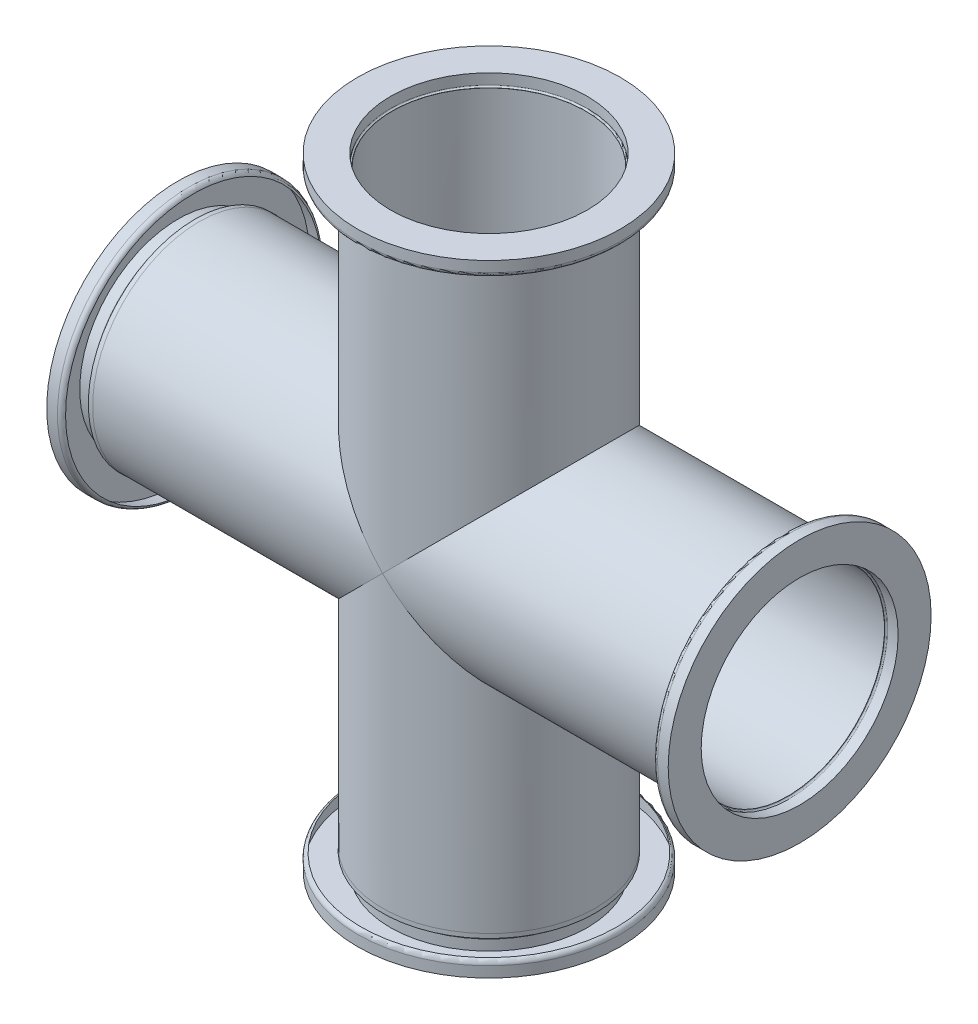
ISO-10303-21;
HEADER;
FILE_DESCRIPTION(('STEP AP214'),'2;1');
FILE_NAME('part.step','',(''),(''),'','','');
FILE_SCHEMA(('AUTOMOTIVE_DESIGN { 1 0 10303 214 1 1 1 1 }'));
ENDSEC;
DATA;
#1=APPLICATION_CONTEXT('core data for automotive mechanical design processes');
#2=APPLICATION_PROTOCOL_DEFINITION('international standard','automotive_design',2000,#1);
#3=PRODUCT_CONTEXT('',#1,'mechanical');
#4=PRODUCT('Part','Part','',(#3));
#5=PRODUCT_RELATED_PRODUCT_CATEGORY('part','',(#4));
#6=PRODUCT_DEFINITION_FORMATION('','',#4);
#7=PRODUCT_DEFINITION_CONTEXT('part definition',#1,'design');
#8=PRODUCT_DEFINITION('design','',#6,#7);
#9=PRODUCT_DEFINITION_SHAPE('','',#8);
#10=(LENGTH_UNIT() NAMED_UNIT(*) SI_UNIT(.MILLI.,.METRE.));
#11=(NAMED_UNIT(*) PLANE_ANGLE_UNIT() SI_UNIT($,.RADIAN.));
#12=(NAMED_UNIT(*) SI_UNIT($,.STERADIAN.) SOLID_ANGLE_UNIT());
#13=UNCERTAINTY_MEASURE_WITH_UNIT(LENGTH_MEASURE(1.E-05),#10,'distance_accuracy_value','');
#14=(GEOMETRIC_REPRESENTATION_CONTEXT(3) GLOBAL_UNCERTAINTY_ASSIGNED_CONTEXT((#13)) GLOBAL_UNIT_ASSIGNED_CONTEXT((#10,
#11,#12)) REPRESENTATION_CONTEXT('',''));
#15=CARTESIAN_POINT('',(0.,0.,0.));
#16=DIRECTION('',(0.,0.,1.));
#17=DIRECTION('',(1.,0.,0.));
#18=AXIS2_PLACEMENT_3D('',#15,#16,#17);
#19=CARTESIAN_POINT('',(0.,61.5,0.));
#20=DIRECTION('',(0.,1.,0.));
#21=DIRECTION('',(0.,0.,-1.));
#22=AXIS2_PLACEMENT_3D('',#19,#20,#21);
#23=PLANE('',#22);
#24=CARTESIAN_POINT('',(0.,61.5,0.));
#25=DIRECTION('',(0.,1.,0.));
#26=DIRECTION('',(0.,0.,1.));
#27=AXIS2_PLACEMENT_3D('',#24,#25,#26);
#28=CIRCLE('',#27,22.25);
#29=CARTESIAN_POINT('',(0.,61.5,22.25));
#30=VERTEX_POINT('',#29);
#31=EDGE_CURVE('E407',#30,#30,#28,.T.);
#32=ORIENTED_EDGE('',*,*,#31,.T.);
#33=EDGE_LOOP('',(#32));
#34=FACE_BOUND('',#33,.T.);
#35=CARTESIAN_POINT('',(0.,61.5,0.));
#36=DIRECTION('',(0.,1.,0.));
#37=DIRECTION('',(-1.,0.,0.));
#38=AXIS2_PLACEMENT_3D('',#35,#36,#37);
#39=CIRCLE('',#38,22.3);
#40=CARTESIAN_POINT('',(22.3,61.5,0.));
#41=VERTEX_POINT('',#40);
#42=EDGE_CURVE('E188',#41,#41,#39,.T.);
#43=ORIENTED_EDGE('',*,*,#42,.F.);
#44=EDGE_LOOP('',(#43));
#45=FACE_BOUND('',#44,.T.);
#46=ADVANCED_FACE('F17',(#34,#45),#23,.F.);
#47=CARTESIAN_POINT('',(0.,-61.5,0.));
#48=DIRECTION('',(0.,-1.,0.));
#49=DIRECTION('',(0.,0.,-1.));
#50=AXIS2_PLACEMENT_3D('',#47,#48,#49);
#51=PLANE('',#50);
#52=CARTESIAN_POINT('',(0.,-61.5,0.));
#53=DIRECTION('',(0.,1.,0.));
#54=DIRECTION('',(0.,0.,-1.));
#55=AXIS2_PLACEMENT_3D('',#52,#53,#54);
#56=CIRCLE('',#55,22.25);
#57=CARTESIAN_POINT('',(0.,-61.5,-22.25));
#58=VERTEX_POINT('',#57);
#59=EDGE_CURVE('E312',#58,#58,#56,.T.);
#60=ORIENTED_EDGE('',*,*,#59,.F.);
#61=EDGE_LOOP('',(#60));
#62=FACE_BOUND('',#61,.T.);
#63=CARTESIAN_POINT('',(0.,-61.5,0.));
#64=DIRECTION('',(0.,-1.,0.));
#65=DIRECTION('',(-1.,0.,0.));
#66=AXIS2_PLACEMENT_3D('',#63,#64,#65);
#67=CIRCLE('',#66,22.3);
#68=CARTESIAN_POINT('',(22.3,-61.5,0.));
#69=VERTEX_POINT('',#68);
#70=EDGE_CURVE('E270',#69,#69,#67,.T.);
#71=ORIENTED_EDGE('',*,*,#70,.F.);
#72=EDGE_LOOP('',(#71));
#73=FACE_BOUND('',#72,.T.);
#74=ADVANCED_FACE('F536',(#62,#73),#51,.F.);
#75=CARTESIAN_POINT('',(61.5,0.,0.));
#76=DIRECTION('',(1.,0.,0.));
#77=DIRECTION('',(0.,0.,-1.));
#78=AXIS2_PLACEMENT_3D('',#75,#76,#77);
#79=PLANE('',#78);
#80=CARTESIAN_POINT('',(61.5,0.,0.));
#81=DIRECTION('',(1.,0.,0.));
#82=DIRECTION('',(0.,0.,1.));
#83=AXIS2_PLACEMENT_3D('',#80,#81,#82);
#84=CIRCLE('',#83,22.25);
#85=CARTESIAN_POINT('',(61.5,0.,22.25));
#86=VERTEX_POINT('',#85);
#87=EDGE_CURVE('E506',#86,#86,#84,.T.);
#88=ORIENTED_EDGE('',*,*,#87,.T.);
#89=EDGE_LOOP('',(#88));
#90=FACE_BOUND('',#89,.T.);
#91=CARTESIAN_POINT('',(61.5,0.,0.));
#92=DIRECTION('',(1.,0.,0.));
#93=DIRECTION('',(0.,0.,-1.));
#94=AXIS2_PLACEMENT_3D('',#91,#92,#93);
#95=CIRCLE('',#94,22.3);
#96=CARTESIAN_POINT('',(61.5,0.,22.3));
#97=VERTEX_POINT('',#96);
#98=EDGE_CURVE('E258',#97,#97,#95,.T.);
#99=ORIENTED_EDGE('',*,*,#98,.F.);
#100=EDGE_LOOP('',(#99));
#101=FACE_BOUND('',#100,.T.);
#102=ADVANCED_FACE('F534',(#90,#101),#79,.F.);
#103=CARTESIAN_POINT('',(0.,-62.5,0.));
#104=DIRECTION('',(0.,-1.,0.));
#105=DIRECTION('',(0.,0.,-1.));
#106=AXIS2_PLACEMENT_3D('',#103,#104,#105);
#107=PLANE('',#106);
#108=CARTESIAN_POINT('',(0.,-62.5,0.));
#109=DIRECTION('',(0.,-1.,0.));
#110=DIRECTION('',(-1.,0.,0.));
#111=AXIS2_PLACEMENT_3D('',#108,#109,#110);
#112=CIRCLE('',#111,20.25);
#113=CARTESIAN_POINT('',(20.25,-62.5,0.));
#114=VERTEX_POINT('',#113);
#115=EDGE_CURVE('E416',#114,#114,#112,.T.);
#116=ORIENTED_EDGE('',*,*,#115,.F.);
#117=EDGE_LOOP('',(#116));
#118=FACE_BOUND('',#117,.T.);
#119=CARTESIAN_POINT('',(0.,-62.5,0.));
#120=DIRECTION('',(0.,-1.,0.));
#121=DIRECTION('',(-1.,0.,0.));
#122=AXIS2_PLACEMENT_3D('',#119,#120,#121);
#123=CIRCLE('',#122,20.3);
#124=CARTESIAN_POINT('',(20.3,-62.5,0.));
#125=VERTEX_POINT('',#124);
#126=EDGE_CURVE('E232',#125,#125,#123,.T.);
#127=ORIENTED_EDGE('',*,*,#126,.T.);
#128=EDGE_LOOP('',(#127));
#129=FACE_BOUND('',#128,.T.);
#130=ADVANCED_FACE('F238',(#118,#129),#107,.T.);
#131=CARTESIAN_POINT('',(0.,62.5,0.));
#132=DIRECTION('',(0.,1.,0.));
#133=DIRECTION('',(0.,0.,-1.));
#134=AXIS2_PLACEMENT_3D('',#131,#132,#133);
#135=PLANE('',#134);
#136=CARTESIAN_POINT('',(0.,62.5,0.));
#137=DIRECTION('',(0.,1.,0.));
#138=DIRECTION('',(-1.,0.,0.));
#139=AXIS2_PLACEMENT_3D('',#136,#137,#138);
#140=CIRCLE('',#139,20.25);
#141=CARTESIAN_POINT('',(20.25,62.5,0.));
#142=VERTEX_POINT('',#141);
#143=EDGE_CURVE('E362',#142,#142,#140,.T.);
#144=ORIENTED_EDGE('',*,*,#143,.F.);
#145=EDGE_LOOP('',(#144));
#146=FACE_BOUND('',#145,.T.);
#147=CARTESIAN_POINT('',(0.,62.5,0.));
#148=DIRECTION('',(0.,1.,0.));
#149=DIRECTION('',(-1.,0.,0.));
#150=AXIS2_PLACEMENT_3D('',#147,#148,#149);
#151=CIRCLE('',#150,20.3);
#152=CARTESIAN_POINT('',(20.3,62.5,0.));
#153=VERTEX_POINT('',#152);
#154=EDGE_CURVE('E517',#153,#153,#151,.T.);
#155=ORIENTED_EDGE('',*,*,#154,.T.);
#156=EDGE_LOOP('',(#155));
#157=FACE_BOUND('',#156,.T.);
#158=ADVANCED_FACE('F544',(#146,#157),#135,.T.);
#159=CARTESIAN_POINT('',(62.5,0.,0.));
#160=DIRECTION('',(1.,0.,0.));
#161=DIRECTION('',(0.,0.,-1.));
#162=AXIS2_PLACEMENT_3D('',#159,#160,#161);
#163=PLANE('',#162);
#164=CARTESIAN_POINT('',(62.5,0.,0.));
#165=DIRECTION('',(1.,0.,0.));
#166=DIRECTION('',(0.,0.,-1.));
#167=AXIS2_PLACEMENT_3D('',#164,#165,#166);
#168=CIRCLE('',#167,20.25);
#169=CARTESIAN_POINT('',(62.5,0.,20.25));
#170=VERTEX_POINT('',#169);
#171=EDGE_CURVE('E240',#170,#170,#168,.T.);
#172=ORIENTED_EDGE('',*,*,#171,.F.);
#173=EDGE_LOOP('',(#172));
#174=FACE_BOUND('',#173,.T.);
#175=CARTESIAN_POINT('',(62.5,0.,0.));
#176=DIRECTION('',(1.,0.,0.));
#177=DIRECTION('',(0.,0.,-1.));
#178=AXIS2_PLACEMENT_3D('',#175,#176,#177);
#179=CIRCLE('',#178,20.3);
#180=CARTESIAN_POINT('',(62.5,0.,20.3));
#181=VERTEX_POINT('',#180);
#182=EDGE_CURVE('E495',#181,#181,#179,.T.);
#183=ORIENTED_EDGE('',*,*,#182,.T.);
#184=EDGE_LOOP('',(#183));
#185=FACE_BOUND('',#184,.T.);
#186=ADVANCED_FACE('F594',(#174,#185),#163,.T.);
#187=CARTESIAN_POINT('',(0.,-65.,0.));
#188=DIRECTION('',(0.,1.,0.));
#189=DIRECTION('',(0.,0.,-1.));
#190=AXIS2_PLACEMENT_3D('',#187,#188,#189);
#191=PLANE('',#190);
#192=CARTESIAN_POINT('',(0.,-65.,0.));
#193=DIRECTION('',(0.,-1.,0.));
#194=DIRECTION('',(-1.,0.,0.));
#195=AXIS2_PLACEMENT_3D('',#192,#193,#194);
#196=CIRCLE('',#195,20.6);
#197=CARTESIAN_POINT('',(20.6,-65.,0.));
#198=VERTEX_POINT('',#197);
#199=EDGE_CURVE('E279',#198,#198,#196,.T.);
#200=ORIENTED_EDGE('',*,*,#199,.F.);
#201=EDGE_LOOP('',(#200));
#202=FACE_BOUND('',#201,.T.);
#203=CARTESIAN_POINT('',(0.,-65.,0.));
#204=DIRECTION('',(0.,1.,0.));
#205=DIRECTION('',(1.,0.,0.));
#206=AXIS2_PLACEMENT_3D('',#203,#204,#205);
#207=CIRCLE('',#206,27.5);
#208=CARTESIAN_POINT('',(27.5,-65.,0.));
#209=VERTEX_POINT('',#208);
#210=EDGE_CURVE('E329',#209,#209,#207,.T.);
#211=ORIENTED_EDGE('',*,*,#210,.F.);
#212=EDGE_LOOP('',(#211));
#213=FACE_BOUND('',#212,.T.);
#214=ADVANCED_FACE('F577',(#202,#213),#191,.F.);
#215=CARTESIAN_POINT('',(0.,65.,0.));
#216=DIRECTION('',(0.,-1.,0.));
#217=DIRECTION('',(-1.,0.,0.));
#218=AXIS2_PLACEMENT_3D('',#215,#216,#217);
#219=PLANE('',#218);
#220=CARTESIAN_POINT('',(0.,65.,0.));
#221=DIRECTION('',(0.,1.,0.));
#222=DIRECTION('',(-1.,0.,0.));
#223=AXIS2_PLACEMENT_3D('',#220,#221,#222);
#224=CIRCLE('',#223,20.6);
#225=CARTESIAN_POINT('',(20.6,65.,0.));
#226=VERTEX_POINT('',#225);
#227=EDGE_CURVE('E339',#226,#226,#224,.T.);
#228=ORIENTED_EDGE('',*,*,#227,.F.);
#229=EDGE_LOOP('',(#228));
#230=FACE_BOUND('',#229,.T.);
#231=CARTESIAN_POINT('',(0.,65.,0.));
#232=DIRECTION('',(0.,-1.,0.));
#233=DIRECTION('',(1.,0.,0.));
#234=AXIS2_PLACEMENT_3D('',#231,#232,#233);
#235=CIRCLE('',#234,27.5);
#236=CARTESIAN_POINT('',(27.5,65.,0.));
#237=VERTEX_POINT('',#236);
#238=EDGE_CURVE('E373',#237,#237,#235,.T.);
#239=ORIENTED_EDGE('',*,*,#238,.F.);
#240=EDGE_LOOP('',(#239));
#241=FACE_BOUND('',#240,.T.);
#242=ADVANCED_FACE('F574',(#230,#241),#219,.F.);
#243=CARTESIAN_POINT('',(65.,0.,0.));
#244=DIRECTION('',(-1.,0.,0.));
#245=DIRECTION('',(0.,1.,0.));
#246=AXIS2_PLACEMENT_3D('',#243,#244,#245);
#247=PLANE('',#246);
#248=CARTESIAN_POINT('',(65.,0.,0.));
#249=DIRECTION('',(1.,0.,0.));
#250=DIRECTION('',(0.,0.,-1.));
#251=AXIS2_PLACEMENT_3D('',#248,#249,#250);
#252=CIRCLE('',#251,20.6);
#253=CARTESIAN_POINT('',(65.,0.,20.6));
#254=VERTEX_POINT('',#253);
#255=EDGE_CURVE('E469',#254,#254,#252,.T.);
#256=ORIENTED_EDGE('',*,*,#255,.F.);
#257=EDGE_LOOP('',(#256));
#258=FACE_BOUND('',#257,.T.);
#259=CARTESIAN_POINT('',(65.,0.,0.));
#260=DIRECTION('',(-1.,0.,0.));
#261=DIRECTION('',(0.,0.,1.));
#262=AXIS2_PLACEMENT_3D('',#259,#260,#261);
#263=CIRCLE('',#262,27.5);
#264=CARTESIAN_POINT('',(65.,0.,27.5));
#265=VERTEX_POINT('',#264);
#266=EDGE_CURVE('E465',#265,#265,#263,.T.);
#267=ORIENTED_EDGE('',*,*,#266,.F.);
#268=EDGE_LOOP('',(#267));
#269=FACE_BOUND('',#268,.T.);
#270=ADVANCED_FACE('F576',(#258,#269),#247,.F.);
#271=CARTESIAN_POINT('',(-61.5,0.,0.));
#272=DIRECTION('',(-1.,0.,0.));
#273=DIRECTION('',(0.,1.,0.));
#274=AXIS2_PLACEMENT_3D('',#271,#272,#273);
#275=PLANE('',#274);
#276=CARTESIAN_POINT('',(-61.5,0.,0.));
#277=DIRECTION('',(-1.,0.,0.));
#278=DIRECTION('',(0.,0.,1.));
#279=AXIS2_PLACEMENT_3D('',#276,#277,#278);
#280=CIRCLE('',#279,22.25);
#281=CARTESIAN_POINT('',(-61.5,0.,22.25));
#282=VERTEX_POINT('',#281);
#283=EDGE_CURVE('E426',#282,#282,#280,.T.);
#284=ORIENTED_EDGE('',*,*,#283,.T.);
#285=EDGE_LOOP('',(#284));
#286=FACE_BOUND('',#285,.T.);
#287=CARTESIAN_POINT('',(-61.5,0.,0.));
#288=DIRECTION('',(-1.,0.,0.));
#289=DIRECTION('',(0.,-0.0582403077273959,0.998302592682108));
#290=AXIS2_PLACEMENT_3D('',#287,#288,#289);
#291=CIRCLE('',#290,22.3);
#292=CARTESIAN_POINT('',(-61.5,1.29875886232092,-22.262147816811));
#293=VERTEX_POINT('',#292);
#294=EDGE_CURVE('E311',#293,#293,#291,.T.);
#295=ORIENTED_EDGE('',*,*,#294,.F.);
#296=EDGE_LOOP('',(#295));
#297=FACE_BOUND('',#296,.T.);
#298=ADVANCED_FACE('F606',(#286,#297),#275,.F.);
#299=CARTESIAN_POINT('',(-62.5,0.,0.));
#300=DIRECTION('',(-1.,0.,0.));
#301=DIRECTION('',(0.,1.,0.));
#302=AXIS2_PLACEMENT_3D('',#299,#300,#301);
#303=PLANE('',#302);
#304=CARTESIAN_POINT('',(-62.5,0.,0.));
#305=DIRECTION('',(-1.,0.,0.));
#306=DIRECTION('',(0.,-0.0582403077273959,0.998302592682108));
#307=AXIS2_PLACEMENT_3D('',#304,#305,#306);
#308=CIRCLE('',#307,20.25);
#309=CARTESIAN_POINT('',(-62.5,1.17936623147976,-20.2156275018127));
#310=VERTEX_POINT('',#309);
#311=EDGE_CURVE('E269',#310,#310,#308,.T.);
#312=ORIENTED_EDGE('',*,*,#311,.F.);
#313=EDGE_LOOP('',(#312));
#314=FACE_BOUND('',#313,.T.);
#315=CARTESIAN_POINT('',(-62.5,0.,0.));
#316=DIRECTION('',(-1.,0.,0.));
#317=DIRECTION('',(0.,-0.0582403077273959,0.998302592682108));
#318=AXIS2_PLACEMENT_3D('',#315,#316,#317);
#319=CIRCLE('',#318,20.3);
#320=CARTESIAN_POINT('',(-62.5,1.18227824686613,-20.2655426314468));
#321=VERTEX_POINT('',#320);
#322=EDGE_CURVE('E264',#321,#321,#319,.T.);
#323=ORIENTED_EDGE('',*,*,#322,.T.);
#324=EDGE_LOOP('',(#323));
#325=FACE_BOUND('',#324,.T.);
#326=ADVANCED_FACE('F610',(#314,#325),#303,.T.);
#327=CARTESIAN_POINT('',(-65.,0.,0.));
#328=DIRECTION('',(1.,0.,0.));
#329=DIRECTION('',(0.,1.,0.));
#330=AXIS2_PLACEMENT_3D('',#327,#328,#329);
#331=PLANE('',#330);
#332=CARTESIAN_POINT('',(-65.,0.,0.));
#333=DIRECTION('',(-1.,0.,0.));
#334=DIRECTION('',(0.,-0.0582403077273959,0.998302592682108));
#335=AXIS2_PLACEMENT_3D('',#332,#333,#334);
#336=CIRCLE('',#335,20.6);
#337=CARTESIAN_POINT('',(-65.,1.19975033918435,-20.5650334092514));
#338=VERTEX_POINT('',#337);
#339=EDGE_CURVE('E11',#338,#338,#336,.T.);
#340=ORIENTED_EDGE('',*,*,#339,.F.);
#341=EDGE_LOOP('',(#340));
#342=FACE_BOUND('',#341,.T.);
#343=CARTESIAN_POINT('',(-65.,0.,0.));
#344=DIRECTION('',(1.,0.,0.));
#345=DIRECTION('',(0.,0.0582403077273959,-0.998302592682108));
#346=AXIS2_PLACEMENT_3D('',#343,#344,#345);
#347=CIRCLE('',#346,27.5);
#348=CARTESIAN_POINT('',(-65.,1.60160846250338,-27.453321298758));
#349=VERTEX_POINT('',#348);
#350=EDGE_CURVE('E287',#349,#349,#347,.T.);
#351=ORIENTED_EDGE('',*,*,#350,.F.);
#352=EDGE_LOOP('',(#351));
#353=FACE_BOUND('',#352,.T.);
#354=ADVANCED_FACE('F567',(#342,#353),#331,.F.);
#355=CARTESIAN_POINT('',(-62.5,0.,0.));
#356=DIRECTION('',(-1.,0.,0.));
#357=DIRECTION('',(0.,-0.0582403077273959,0.998302592682108));
#358=AXIS2_PLACEMENT_3D('',#355,#356,#357);
#359=CYLINDRICAL_SURFACE('',#358,20.6);
#360=CARTESIAN_POINT('',(-62.8,0.,0.));
#361=DIRECTION('',(1.,0.,0.));
#362=DIRECTION('',(0.,-0.0582403077273959,0.998302592682108));
#363=AXIS2_PLACEMENT_3D('',#360,#361,#362);
#364=CIRCLE('',#363,20.6);
#365=CARTESIAN_POINT('',(-62.8,1.19975033918435,-20.5650334092514));
#366=VERTEX_POINT('',#365);
#367=EDGE_CURVE('E321',#366,#366,#364,.T.);
#368=ORIENTED_EDGE('',*,*,#367,.T.);
#369=DIRECTION('',(-1.,0.,0.));
#370=VECTOR('',#369,1.);
#371=CARTESIAN_POINT('',(-62.5,1.19975033918435,-20.5650334092514));
#372=LINE('',#371,#370);
#373=EDGE_CURVE('E28',#366,#338,#372,.T.);
#374=ORIENTED_EDGE('',*,*,#373,.T.);
#375=ORIENTED_EDGE('',*,*,#339,.T.);
#376=ORIENTED_EDGE('',*,*,#373,.F.);
#377=EDGE_LOOP('',(#368,#374,#375,#376));
#378=FACE_BOUND('',#377,.T.);
#379=ADVANCED_FACE('F563',(#378),#359,.F.);
#380=CARTESIAN_POINT('',(-62.8,0.,0.));
#381=DIRECTION('',(-1.,0.,0.));
#382=DIRECTION('',(0.,-0.0582403077273959,0.998302592682108));
#383=AXIS2_PLACEMENT_3D('',#380,#381,#382);
#384=TOROIDAL_SURFACE('',#383,20.3,0.3);
#385=ORIENTED_EDGE('',*,*,#322,.F.);
#386=CARTESIAN_POINT('',(-62.8,1.18227824686613,-20.2655426314468));
#387=DIRECTION('',(0.,0.998302592682108,0.0582403077273958));
#388=DIRECTION('',(0.,0.0582403077273958,-0.998302592682108));
#389=AXIS2_PLACEMENT_3D('',#386,#387,#388);
#390=CIRCLE('',#389,0.3);
#391=EDGE_CURVE('E268',#321,#366,#390,.T.);
#392=ORIENTED_EDGE('',*,*,#391,.T.);
#393=ORIENTED_EDGE('',*,*,#367,.F.);
#394=ORIENTED_EDGE('',*,*,#391,.F.);
#395=EDGE_LOOP('',(#385,#392,#393,#394));
#396=FACE_BOUND('',#395,.T.);
#397=ADVANCED_FACE('F566',(#396),#384,.F.);
#398=CARTESIAN_POINT('',(-54.6313972081443,0.,0.));
#399=DIRECTION('',(-1.,0.,0.));
#400=DIRECTION('',(0.,-0.0582403077273959,0.998302592682108));
#401=AXIS2_PLACEMENT_3D('',#398,#399,#400);
#402=CYLINDRICAL_SURFACE('',#401,20.25);
#403=CARTESIAN_POINT('',(1.94289029309402E-13,2.11775041947249E-13,0.));
#404=DIRECTION('',(0.707106781186547,-0.707106781186548,0.));
#405=DIRECTION('',(0.707106781186548,0.707106781186547,0.));
#406=AXIS2_PLACEMENT_3D('',#403,#404,#405);
#407=ELLIPSE('',#406,28.6378246380554,20.25);
#408=CARTESIAN_POINT('',(-1.17936623147979,-1.17936623147976,20.2156275018127));
#409=VERTEX_POINT('',#408);
#410=CARTESIAN_POINT('',(0.,0.,-20.25));
#411=VERTEX_POINT('',#410);
#412=EDGE_CURVE('E328',#409,#411,#407,.T.);
#413=ORIENTED_EDGE('',*,*,#412,.T.);
#414=CARTESIAN_POINT('',(-0.000187741222182879,0.000187741251011447,20.2199304466588));
#415=DIRECTION('',(0.707106781186536,0.707106781186559,-5.0372229393621E-13));
#416=DIRECTION('',(-0.02913715139161,0.0291371513908973,-0.999150665724447));
#417=AXIS2_PLACEMENT_3D('',#414,#415,#416);
#418=CIRCLE('',#417,40.4699304475298);
#419=CARTESIAN_POINT('',(-1.17936623147979,1.17936623147977,-20.2156275018127));
#420=VERTEX_POINT('',#419);
#421=EDGE_CURVE('E250',#411,#420,#418,.T.);
#422=ORIENTED_EDGE('',*,*,#421,.T.);
#423=DIRECTION('',(-1.,0.,0.));
#424=VECTOR('',#423,1.);
#425=CARTESIAN_POINT('',(-54.6313972081443,1.17936623147976,-20.2156275018127));
#426=LINE('',#425,#424);
#427=EDGE_CURVE('E317',#420,#310,#426,.T.);
#428=ORIENTED_EDGE('',*,*,#427,.T.);
#429=ORIENTED_EDGE('',*,*,#311,.T.);
#430=ORIENTED_EDGE('',*,*,#427,.F.);
#431=CARTESIAN_POINT('',(0.,0.,0.));
#432=DIRECTION('',(0.707106781186547,0.707106781186548,0.));
#433=DIRECTION('',(0.707106781186548,-0.707106781186547,0.));
#434=AXIS2_PLACEMENT_3D('',#431,#432,#433);
#435=ELLIPSE('',#434,28.6378246380551,20.25);
#436=CARTESIAN_POINT('',(0.,0.,20.25));
#437=VERTEX_POINT('',#436);
#438=EDGE_CURVE('E303',#420,#437,#435,.T.);
#439=ORIENTED_EDGE('',*,*,#438,.T.);
#440=CARTESIAN_POINT('',(-0.000187741233303084,-0.000187741244010163,-20.2199304466162));
#441=DIRECTION('',(0.707106781186537,-0.707106781186558,1.87069954220389E-13));
#442=DIRECTION('',(-0.029137151391366,-0.0291371513911008,0.999150665724449));
#443=AXIS2_PLACEMENT_3D('',#440,#441,#442);
#444=CIRCLE('',#443,40.4699304474871);
#445=EDGE_CURVE('E297',#437,#409,#444,.T.);
#446=ORIENTED_EDGE('',*,*,#445,.T.);
#447=EDGE_LOOP('',(#413,#422,#428,#429,#430,#439,#446));
#448=FACE_BOUND('',#447,.T.);
#449=ADVANCED_FACE('F651',(#448),#402,.F.);
#450=CARTESIAN_POINT('',(-62.,0.,0.));
#451=DIRECTION('',(-1.,0.,0.));
#452=DIRECTION('',(0.,-0.0582403077273959,0.998302592682108));
#453=AXIS2_PLACEMENT_3D('',#450,#451,#452);
#454=CYLINDRICAL_SURFACE('',#453,27.5);
#455=ORIENTED_EDGE('',*,*,#350,.T.);
#456=DIRECTION('',(1.,0.,0.));
#457=VECTOR('',#456,1.);
#458=CARTESIAN_POINT('',(-62.,1.60160846250338,-27.453321298758));
#459=LINE('',#458,#457);
#460=CARTESIAN_POINT('',(-62.767326987979,1.60160846250338,-27.453321298758));
#461=VERTEX_POINT('',#460);
#462=EDGE_CURVE('E291',#349,#461,#459,.T.);
#463=ORIENTED_EDGE('',*,*,#462,.T.);
#464=CARTESIAN_POINT('',(-62.767326987979,0.,0.));
#465=DIRECTION('',(-1.,0.,0.));
#466=DIRECTION('',(0.,-0.0582403077273959,0.998302592682108));
#467=AXIS2_PLACEMENT_3D('',#464,#465,#466);
#468=CIRCLE('',#467,27.5);
#469=EDGE_CURVE('E252',#461,#461,#468,.T.);
#470=ORIENTED_EDGE('',*,*,#469,.T.);
#471=ORIENTED_EDGE('',*,*,#462,.F.);
#472=EDGE_LOOP('',(#455,#463,#470,#471));
#473=FACE_BOUND('',#472,.T.);
#474=ADVANCED_FACE('F572',(#473),#454,.T.);
#475=CARTESIAN_POINT('',(-62.767326987979,0.,0.));
#476=DIRECTION('',(-1.,0.,0.));
#477=DIRECTION('',(0.,-0.0582403077273959,0.998302592682108));
#478=AXIS2_PLACEMENT_3D('',#475,#476,#477);
#479=TOROIDAL_SURFACE('',#478,26.5,1.);
#480=ORIENTED_EDGE('',*,*,#469,.F.);
#481=CARTESIAN_POINT('',(-62.767326987979,1.54336815477598,-26.4550187060759));
#482=DIRECTION('',(0.,-0.998302592682108,-0.0582403077273958));
#483=DIRECTION('',(0.,0.0582403077273958,-0.998302592682108));
#484=AXIS2_PLACEMENT_3D('',#481,#482,#483);
#485=CIRCLE('',#484,1.);
#486=CARTESIAN_POINT('',(-61.8014011616896,1.55844185560852,-26.7133984298374));
#487=VERTEX_POINT('',#486);
#488=EDGE_CURVE('E256',#461,#487,#485,.T.);
#489=ORIENTED_EDGE('',*,*,#488,.T.);
#490=CARTESIAN_POINT('',(-61.8014011616899,0.,0.));
#491=DIRECTION('',(1.,0.,0.));
#492=DIRECTION('',(0.,0.0582403077273959,-0.998302592682108));
#493=AXIS2_PLACEMENT_3D('',#490,#491,#492);
#494=CIRCLE('',#493,26.7588190451025);
#495=EDGE_CURVE('E400',#487,#487,#494,.T.);
#496=ORIENTED_EDGE('',*,*,#495,.F.);
#497=ORIENTED_EDGE('',*,*,#488,.F.);
#498=EDGE_LOOP('',(#480,#489,#496,#497));
#499=FACE_BOUND('',#498,.T.);
#500=ADVANCED_FACE('F568',(#499),#479,.T.);
#501=CARTESIAN_POINT('',(-1054.63139720814,-1.49879965736563E-13,0.));
#502=DIRECTION('',(-1.,0.,0.));
#503=DIRECTION('',(0.,-0.0582403077273959,0.998302592682108));
#504=AXIS2_PLACEMENT_3D('',#501,#502,#503);
#505=CONICAL_SURFACE('',#504,3732.05080756898,1.30899693899575);
#506=ORIENTED_EDGE('',*,*,#495,.T.);
#507=DIRECTION('',(0.258819045102515,-0.0562558173649145,0.964286256722986));
#508=VECTOR('',#507,1.);
#509=CARTESIAN_POINT('',(-1054.63139720814,217.355787487093,-3725.71599721746));
#510=LINE('',#509,#508);
#511=CARTESIAN_POINT('',(-60.6066641993582,1.29875886232092,-22.262147816811));
#512=VERTEX_POINT('',#511);
#513=EDGE_CURVE('E257',#487,#512,#510,.T.);
#514=ORIENTED_EDGE('',*,*,#513,.T.);
#515=CARTESIAN_POINT('',(-60.6066641993582,0.,0.));
#516=DIRECTION('',(-1.,0.,0.));
#517=DIRECTION('',(0.,-0.0582403077273959,0.998302592682108));
#518=AXIS2_PLACEMENT_3D('',#515,#516,#517);
#519=CIRCLE('',#518,22.3);
#520=EDGE_CURVE('E281',#512,#512,#519,.T.);
#521=ORIENTED_EDGE('',*,*,#520,.T.);
#522=ORIENTED_EDGE('',*,*,#513,.F.);
#523=EDGE_LOOP('',(#506,#514,#521,#522));
#524=FACE_BOUND('',#523,.T.);
#525=ADVANCED_FACE('F571',(#524),#505,.T.);
#526=CARTESIAN_POINT('',(-60.0573683548744,0.,0.));
#527=DIRECTION('',(-1.,0.,0.));
#528=DIRECTION('',(0.,-0.0582403077273959,0.998302592682108));
#529=AXIS2_PLACEMENT_3D('',#526,#527,#528);
#530=CYLINDRICAL_SURFACE('',#529,22.3);
#531=ORIENTED_EDGE('',*,*,#520,.F.);
#532=DIRECTION('',(-1.,0.,0.));
#533=VECTOR('',#532,1.);
#534=CARTESIAN_POINT('',(-60.0573683548744,1.29875886232092,-22.262147816811));
#535=LINE('',#534,#533);
#536=EDGE_CURVE('E285',#512,#293,#535,.T.);
#537=ORIENTED_EDGE('',*,*,#536,.T.);
#538=ORIENTED_EDGE('',*,*,#294,.T.);
#539=ORIENTED_EDGE('',*,*,#536,.F.);
#540=EDGE_LOOP('',(#531,#537,#538,#539));
#541=FACE_BOUND('',#540,.T.);
#542=ADVANCED_FACE('F633',(#541),#530,.F.);
#543=CARTESIAN_POINT('',(62.,0.,0.));
#544=DIRECTION('',(1.,0.,0.));
#545=DIRECTION('',(0.,0.,-1.));
#546=AXIS2_PLACEMENT_3D('',#543,#544,#545);
#547=CYLINDRICAL_SURFACE('',#546,27.5);
#548=ORIENTED_EDGE('',*,*,#266,.T.);
#549=DIRECTION('',(-1.,0.,0.));
#550=VECTOR('',#549,1.);
#551=CARTESIAN_POINT('',(62.,0.,27.5));
#552=LINE('',#551,#550);
#553=CARTESIAN_POINT('',(62.767326987979,0.,27.5));
#554=VERTEX_POINT('',#553);
#555=EDGE_CURVE('E286',#265,#554,#552,.T.);
#556=ORIENTED_EDGE('',*,*,#555,.T.);
#557=CARTESIAN_POINT('',(62.767326987979,0.,0.));
#558=DIRECTION('',(1.,0.,0.));
#559=DIRECTION('',(0.,0.,-1.));
#560=AXIS2_PLACEMENT_3D('',#557,#558,#559);
#561=CIRCLE('',#560,27.5);
#562=EDGE_CURVE('E372',#554,#554,#561,.T.);
#563=ORIENTED_EDGE('',*,*,#562,.T.);
#564=ORIENTED_EDGE('',*,*,#555,.F.);
#565=EDGE_LOOP('',(#548,#556,#563,#564));
#566=FACE_BOUND('',#565,.T.);
#567=ADVANCED_FACE('F641',(#566),#547,.T.);
#568=CARTESIAN_POINT('',(62.5,0.,0.));
#569=DIRECTION('',(1.,0.,0.));
#570=DIRECTION('',(0.,0.,-1.));
#571=AXIS2_PLACEMENT_3D('',#568,#569,#570);
#572=CYLINDRICAL_SURFACE('',#571,20.6);
#573=CARTESIAN_POINT('',(62.8,0.,0.));
#574=DIRECTION('',(-1.,0.,0.));
#575=DIRECTION('',(0.,0.,-1.));
#576=AXIS2_PLACEMENT_3D('',#573,#574,#575);
#577=CIRCLE('',#576,20.6);
#578=CARTESIAN_POINT('',(62.8,0.,20.6));
#579=VERTEX_POINT('',#578);
#580=EDGE_CURVE('E340',#579,#579,#577,.T.);
#581=ORIENTED_EDGE('',*,*,#580,.T.);
#582=DIRECTION('',(1.,0.,0.));
#583=VECTOR('',#582,1.);
#584=CARTESIAN_POINT('',(62.5,0.,20.6));
#585=LINE('',#584,#583);
#586=EDGE_CURVE('E414',#579,#254,#585,.T.);
#587=ORIENTED_EDGE('',*,*,#586,.T.);
#588=ORIENTED_EDGE('',*,*,#255,.T.);
#589=ORIENTED_EDGE('',*,*,#586,.F.);
#590=EDGE_LOOP('',(#581,#587,#588,#589));
#591=FACE_BOUND('',#590,.T.);
#592=ADVANCED_FACE('F712',(#591),#572,.F.);
#593=CARTESIAN_POINT('',(0.,62.5,0.));
#594=DIRECTION('',(0.,1.,0.));
#595=DIRECTION('',(-1.,0.,0.));
#596=AXIS2_PLACEMENT_3D('',#593,#594,#595);
#597=CYLINDRICAL_SURFACE('',#596,20.6);
#598=CARTESIAN_POINT('',(0.,62.8,0.));
#599=DIRECTION('',(0.,-1.,0.));
#600=DIRECTION('',(-1.,0.,0.));
#601=AXIS2_PLACEMENT_3D('',#598,#599,#600);
#602=CIRCLE('',#601,20.6);
#603=CARTESIAN_POINT('',(20.6,62.8,0.));
#604=VERTEX_POINT('',#603);
#605=EDGE_CURVE('E280',#604,#604,#602,.T.);
#606=ORIENTED_EDGE('',*,*,#605,.T.);
#607=DIRECTION('',(0.,1.,0.));
#608=VECTOR('',#607,1.);
#609=CARTESIAN_POINT('',(20.6,62.5,0.));
#610=LINE('',#609,#608);
#611=EDGE_CURVE('E335',#604,#226,#610,.T.);
#612=ORIENTED_EDGE('',*,*,#611,.T.);
#613=ORIENTED_EDGE('',*,*,#227,.T.);
#614=ORIENTED_EDGE('',*,*,#611,.F.);
#615=EDGE_LOOP('',(#606,#612,#613,#614));
#616=FACE_BOUND('',#615,.T.);
#617=ADVANCED_FACE('F629',(#616),#597,.F.);
#618=CARTESIAN_POINT('',(62.8,0.,0.));
#619=DIRECTION('',(1.,0.,0.));
#620=DIRECTION('',(0.,0.,-1.));
#621=AXIS2_PLACEMENT_3D('',#618,#619,#620);
#622=TOROIDAL_SURFACE('',#621,20.3,0.3);
#623=ORIENTED_EDGE('',*,*,#182,.F.);
#624=CARTESIAN_POINT('',(62.8,0.,20.3));
#625=DIRECTION('',(0.,1.,0.));
#626=DIRECTION('',(0.,0.,1.));
#627=AXIS2_PLACEMENT_3D('',#624,#625,#626);
#628=CIRCLE('',#627,0.3);
#629=EDGE_CURVE('E499',#181,#579,#628,.T.);
#630=ORIENTED_EDGE('',*,*,#629,.T.);
#631=ORIENTED_EDGE('',*,*,#580,.F.);
#632=ORIENTED_EDGE('',*,*,#629,.F.);
#633=EDGE_LOOP('',(#623,#630,#631,#632));
#634=FACE_BOUND('',#633,.T.);
#635=ADVANCED_FACE('F625',(#634),#622,.F.);
#636=CARTESIAN_POINT('',(0.,-62.5,0.));
#637=DIRECTION('',(0.,-1.,0.));
#638=DIRECTION('',(-1.,0.,0.));
#639=AXIS2_PLACEMENT_3D('',#636,#637,#638);
#640=CYLINDRICAL_SURFACE('',#639,20.6);
#641=CARTESIAN_POINT('',(0.,-62.8,0.));
#642=DIRECTION('',(0.,1.,0.));
#643=DIRECTION('',(-1.,0.,0.));
#644=AXIS2_PLACEMENT_3D('',#641,#642,#643);
#645=CIRCLE('',#644,20.6);
#646=CARTESIAN_POINT('',(20.6,-62.8,0.));
#647=VERTEX_POINT('',#646);
#648=EDGE_CURVE('E234',#647,#647,#645,.T.);
#649=ORIENTED_EDGE('',*,*,#648,.T.);
#650=DIRECTION('',(0.,-1.,0.));
#651=VECTOR('',#650,1.);
#652=CARTESIAN_POINT('',(20.6,-62.5,0.));
#653=LINE('',#652,#651);
#654=EDGE_CURVE('E275',#647,#198,#653,.T.);
#655=ORIENTED_EDGE('',*,*,#654,.T.);
#656=ORIENTED_EDGE('',*,*,#199,.T.);
#657=ORIENTED_EDGE('',*,*,#654,.F.);
#658=EDGE_LOOP('',(#649,#655,#656,#657));
#659=FACE_BOUND('',#658,.T.);
#660=ADVANCED_FACE('F628',(#659),#640,.F.);
#661=CARTESIAN_POINT('',(0.,62.8,0.));
#662=DIRECTION('',(0.,1.,0.));
#663=DIRECTION('',(-1.,0.,0.));
#664=AXIS2_PLACEMENT_3D('',#661,#662,#663);
#665=TOROIDAL_SURFACE('',#664,20.3,0.3);
#666=ORIENTED_EDGE('',*,*,#154,.F.);
#667=CARTESIAN_POINT('',(20.3,62.8,0.));
#668=DIRECTION('',(0.,0.,1.));
#669=DIRECTION('',(1.,0.,0.));
#670=AXIS2_PLACEMENT_3D('',#667,#668,#669);
#671=CIRCLE('',#670,0.3);
#672=EDGE_CURVE('E367',#153,#604,#671,.T.);
#673=ORIENTED_EDGE('',*,*,#672,.T.);
#674=ORIENTED_EDGE('',*,*,#605,.F.);
#675=ORIENTED_EDGE('',*,*,#672,.F.);
#676=EDGE_LOOP('',(#666,#673,#674,#675));
#677=FACE_BOUND('',#676,.T.);
#678=ADVANCED_FACE('F637',(#677),#665,.F.);
#679=CARTESIAN_POINT('',(0.,-62.8,0.));
#680=DIRECTION('',(0.,-1.,0.));
#681=DIRECTION('',(-1.,0.,0.));
#682=AXIS2_PLACEMENT_3D('',#679,#680,#681);
#683=TOROIDAL_SURFACE('',#682,20.3,0.3);
#684=ORIENTED_EDGE('',*,*,#126,.F.);
#685=CARTESIAN_POINT('',(20.3,-62.8,0.));
#686=DIRECTION('',(0.,0.,-1.));
#687=DIRECTION('',(1.,0.,0.));
#688=AXIS2_PLACEMENT_3D('',#685,#686,#687);
#689=CIRCLE('',#688,0.3);
#690=EDGE_CURVE('E229',#125,#647,#689,.T.);
#691=ORIENTED_EDGE('',*,*,#690,.T.);
#692=ORIENTED_EDGE('',*,*,#648,.F.);
#693=ORIENTED_EDGE('',*,*,#690,.F.);
#694=EDGE_LOOP('',(#684,#691,#692,#693));
#695=FACE_BOUND('',#694,.T.);
#696=ADVANCED_FACE('F231',(#695),#683,.F.);
#697=CARTESIAN_POINT('',(54.6313972081443,0.,0.));
#698=DIRECTION('',(1.,0.,0.));
#699=DIRECTION('',(0.,0.,-1.));
#700=AXIS2_PLACEMENT_3D('',#697,#698,#699);
#701=CYLINDRICAL_SURFACE('',#700,20.25);
#702=CARTESIAN_POINT('',(1.59494205791855E-13,-1.46269176955232E-13,1.28785870856518E-13));
#703=DIRECTION('',(0.707106781186549,0.707106781186546,0.));
#704=DIRECTION('',(0.707106781186546,-0.707106781186549,0.));
#705=AXIS2_PLACEMENT_3D('',#702,#703,#704);
#706=ELLIPSE('',#705,28.637824638055,20.25);
#707=CARTESIAN_POINT('',(20.25,-20.25,0.));
#708=VERTEX_POINT('',#707);
#709=EDGE_CURVE('E292',#437,#708,#706,.T.);
#710=ORIENTED_EDGE('',*,*,#709,.F.);
#711=DIRECTION('',(1.,0.,0.));
#712=VECTOR('',#711,1.);
#713=CARTESIAN_POINT('',(54.6313972081443,0.,20.25));
#714=LINE('',#713,#712);
#715=EDGE_CURVE('E246',#437,#170,#714,.T.);
#716=ORIENTED_EDGE('',*,*,#715,.T.);
#717=ORIENTED_EDGE('',*,*,#171,.T.);
#718=ORIENTED_EDGE('',*,*,#715,.F.);
#719=CARTESIAN_POINT('',(-1.19904086659517E-13,-1.19904086659517E-13,0.));
#720=DIRECTION('',(-0.707106781186546,0.707106781186549,0.));
#721=DIRECTION('',(0.707106781186549,0.707106781186546,0.));
#722=AXIS2_PLACEMENT_3D('',#719,#720,#721);
#723=ELLIPSE('',#722,28.6378246380553,20.25);
#724=CARTESIAN_POINT('',(20.25,20.25,0.));
#725=VERTEX_POINT('',#724);
#726=EDGE_CURVE('E356',#437,#725,#723,.T.);
#727=ORIENTED_EDGE('',*,*,#726,.T.);
#728=CARTESIAN_POINT('',(-1.19904086659517E-13,-1.19904086659517E-13,0.));
#729=DIRECTION('',(-0.707106781186546,0.707106781186549,0.));
#730=DIRECTION('',(0.707106781186549,0.707106781186546,0.));
#731=AXIS2_PLACEMENT_3D('',#728,#729,#730);
#732=ELLIPSE('',#731,28.6378246380553,20.25);
#733=EDGE_CURVE('E363',#725,#411,#732,.T.);
#734=ORIENTED_EDGE('',*,*,#733,.T.);
#735=CARTESIAN_POINT('',(1.59494205791855E-13,-1.46269176955232E-13,1.28785870856518E-13));
#736=DIRECTION('',(0.707106781186549,0.707106781186546,0.));
#737=DIRECTION('',(0.707106781186546,-0.707106781186549,0.));
#738=AXIS2_PLACEMENT_3D('',#735,#736,#737);
#739=ELLIPSE('',#738,28.637824638055,20.25);
#740=EDGE_CURVE('E307',#708,#411,#739,.T.);
#741=ORIENTED_EDGE('',*,*,#740,.F.);
#742=EDGE_LOOP('',(#710,#716,#717,#718,#727,#734,#741));
#743=FACE_BOUND('',#742,.T.);
#744=ADVANCED_FACE('F616',(#743),#701,.F.);
#745=CARTESIAN_POINT('',(0.,54.6313972081443,0.));
#746=DIRECTION('',(0.,1.,0.));
#747=DIRECTION('',(-1.,0.,0.));
#748=AXIS2_PLACEMENT_3D('',#745,#746,#747);
#749=CYLINDRICAL_SURFACE('',#748,20.25);
#750=ORIENTED_EDGE('',*,*,#438,.F.);
#751=ORIENTED_EDGE('',*,*,#421,.F.);
#752=ORIENTED_EDGE('',*,*,#733,.F.);
#753=DIRECTION('',(0.,1.,0.));
#754=VECTOR('',#753,1.);
#755=CARTESIAN_POINT('',(20.25,54.6313972081443,0.));
#756=LINE('',#755,#754);
#757=EDGE_CURVE('E358',#725,#142,#756,.T.);
#758=ORIENTED_EDGE('',*,*,#757,.T.);
#759=ORIENTED_EDGE('',*,*,#143,.T.);
#760=ORIENTED_EDGE('',*,*,#757,.F.);
#761=ORIENTED_EDGE('',*,*,#726,.F.);
#762=EDGE_LOOP('',(#750,#751,#752,#758,#759,#760,#761));
#763=FACE_BOUND('',#762,.T.);
#764=ADVANCED_FACE('F612',(#763),#749,.F.);
#765=CARTESIAN_POINT('',(0.,-54.6313972081443,0.));
#766=DIRECTION('',(0.,-1.,0.));
#767=DIRECTION('',(-1.,0.,0.));
#768=AXIS2_PLACEMENT_3D('',#765,#766,#767);
#769=CYLINDRICAL_SURFACE('',#768,20.25);
#770=ORIENTED_EDGE('',*,*,#412,.F.);
#771=ORIENTED_EDGE('',*,*,#445,.F.);
#772=ORIENTED_EDGE('',*,*,#709,.T.);
#773=DIRECTION('',(0.,-1.,0.));
#774=VECTOR('',#773,1.);
#775=CARTESIAN_POINT('',(20.25,-54.6313972081443,0.));
#776=LINE('',#775,#774);
#777=EDGE_CURVE('E296',#708,#114,#776,.T.);
#778=ORIENTED_EDGE('',*,*,#777,.T.);
#779=ORIENTED_EDGE('',*,*,#115,.T.);
#780=ORIENTED_EDGE('',*,*,#777,.F.);
#781=ORIENTED_EDGE('',*,*,#740,.T.);
#782=EDGE_LOOP('',(#770,#771,#772,#778,#779,#780,#781));
#783=FACE_BOUND('',#782,.T.);
#784=ADVANCED_FACE('F615',(#783),#769,.F.);
#785=CARTESIAN_POINT('',(0.,-62.,0.));
#786=DIRECTION('',(0.,-1.,0.));
#787=DIRECTION('',(-1.,0.,0.));
#788=AXIS2_PLACEMENT_3D('',#785,#786,#787);
#789=CYLINDRICAL_SURFACE('',#788,27.5);
#790=ORIENTED_EDGE('',*,*,#210,.T.);
#791=DIRECTION('',(0.,1.,0.));
#792=VECTOR('',#791,1.);
#793=CARTESIAN_POINT('',(27.5,-62.,0.));
#794=LINE('',#793,#792);
#795=CARTESIAN_POINT('',(27.5,-62.767326987979,0.));
#796=VERTEX_POINT('',#795);
#797=EDGE_CURVE('E325',#209,#796,#794,.T.);
#798=ORIENTED_EDGE('',*,*,#797,.T.);
#799=CARTESIAN_POINT('',(0.,-62.767326987979,0.));
#800=DIRECTION('',(0.,-1.,0.));
#801=DIRECTION('',(-1.,0.,0.));
#802=AXIS2_PLACEMENT_3D('',#799,#800,#801);
#803=CIRCLE('',#802,27.5);
#804=EDGE_CURVE('E385',#796,#796,#803,.T.);
#805=ORIENTED_EDGE('',*,*,#804,.T.);
#806=ORIENTED_EDGE('',*,*,#797,.F.);
#807=EDGE_LOOP('',(#790,#798,#805,#806));
#808=FACE_BOUND('',#807,.T.);
#809=ADVANCED_FACE('F590',(#808),#789,.T.);
#810=CARTESIAN_POINT('',(62.767326987979,0.,0.));
#811=DIRECTION('',(1.,0.,0.));
#812=DIRECTION('',(0.,0.,-1.));
#813=AXIS2_PLACEMENT_3D('',#810,#811,#812);
#814=TOROIDAL_SURFACE('',#813,26.5,1.);
#815=ORIENTED_EDGE('',*,*,#562,.F.);
#816=CARTESIAN_POINT('',(62.767326987979,0.,26.5));
#817=DIRECTION('',(0.,-1.,0.));
#818=DIRECTION('',(0.,0.,1.));
#819=AXIS2_PLACEMENT_3D('',#816,#817,#818);
#820=CIRCLE('',#819,1.);
#821=CARTESIAN_POINT('',(61.80140116169,0.,26.7588190451028));
#822=VERTEX_POINT('',#821);
#823=EDGE_CURVE('E344',#554,#822,#820,.T.);
#824=ORIENTED_EDGE('',*,*,#823,.T.);
#825=CARTESIAN_POINT('',(61.8014011616899,0.,0.));
#826=DIRECTION('',(-1.,0.,0.));
#827=DIRECTION('',(0.,0.,1.));
#828=AXIS2_PLACEMENT_3D('',#825,#826,#827);
#829=CIRCLE('',#828,26.7588190451025);
#830=EDGE_CURVE('E374',#822,#822,#829,.T.);
#831=ORIENTED_EDGE('',*,*,#830,.F.);
#832=ORIENTED_EDGE('',*,*,#823,.F.);
#833=EDGE_LOOP('',(#815,#824,#831,#832));
#834=FACE_BOUND('',#833,.T.);
#835=ADVANCED_FACE('F624',(#834),#814,.T.);
#836=CARTESIAN_POINT('',(0.,62.,0.));
#837=DIRECTION('',(0.,1.,0.));
#838=DIRECTION('',(-1.,0.,0.));
#839=AXIS2_PLACEMENT_3D('',#836,#837,#838);
#840=CYLINDRICAL_SURFACE('',#839,27.5);
#841=ORIENTED_EDGE('',*,*,#238,.T.);
#842=DIRECTION('',(0.,-1.,0.));
#843=VECTOR('',#842,1.);
#844=CARTESIAN_POINT('',(27.5,62.,0.));
#845=LINE('',#844,#843);
#846=CARTESIAN_POINT('',(27.5,62.767326987979,0.));
#847=VERTEX_POINT('',#846);
#848=EDGE_CURVE('E370',#237,#847,#845,.T.);
#849=ORIENTED_EDGE('',*,*,#848,.T.);
#850=CARTESIAN_POINT('',(0.,62.767326987979,0.));
#851=DIRECTION('',(0.,1.,0.));
#852=DIRECTION('',(-1.,0.,0.));
#853=AXIS2_PLACEMENT_3D('',#850,#851,#852);
#854=CIRCLE('',#853,27.5);
#855=EDGE_CURVE('E347',#847,#847,#854,.T.);
#856=ORIENTED_EDGE('',*,*,#855,.T.);
#857=ORIENTED_EDGE('',*,*,#848,.F.);
#858=EDGE_LOOP('',(#841,#849,#856,#857));
#859=FACE_BOUND('',#858,.T.);
#860=ADVANCED_FACE('F661',(#859),#840,.T.);
#861=CARTESIAN_POINT('',(0.,-62.767326987979,0.));
#862=DIRECTION('',(0.,-1.,0.));
#863=DIRECTION('',(-1.,0.,0.));
#864=AXIS2_PLACEMENT_3D('',#861,#862,#863);
#865=TOROIDAL_SURFACE('',#864,26.5,1.);
#866=ORIENTED_EDGE('',*,*,#804,.F.);
#867=CARTESIAN_POINT('',(26.5,-62.767326987979,0.));
#868=DIRECTION('',(0.,0.,1.));
#869=DIRECTION('',(1.,0.,0.));
#870=AXIS2_PLACEMENT_3D('',#867,#868,#869);
#871=CIRCLE('',#870,1.);
#872=CARTESIAN_POINT('',(26.7588190451028,-61.80140116169,0.));
#873=VERTEX_POINT('',#872);
#874=EDGE_CURVE('E429',#796,#873,#871,.T.);
#875=ORIENTED_EDGE('',*,*,#874,.T.);
#876=CARTESIAN_POINT('',(0.,-61.8014011616899,0.));
#877=DIRECTION('',(0.,1.,0.));
#878=DIRECTION('',(1.,0.,0.));
#879=AXIS2_PLACEMENT_3D('',#876,#877,#878);
#880=CIRCLE('',#879,26.7588190451025);
#881=EDGE_CURVE('E262',#873,#873,#880,.T.);
#882=ORIENTED_EDGE('',*,*,#881,.F.);
#883=ORIENTED_EDGE('',*,*,#874,.F.);
#884=EDGE_LOOP('',(#866,#875,#882,#883));
#885=FACE_BOUND('',#884,.T.);
#886=ADVANCED_FACE('F19',(#885),#865,.T.);
#887=CARTESIAN_POINT('',(1054.63139720814,0.,-1.35516357278608E-13));
#888=DIRECTION('',(1.,0.,0.));
#889=DIRECTION('',(0.,0.,-1.));
#890=AXIS2_PLACEMENT_3D('',#887,#888,#889);
#891=CONICAL_SURFACE('',#890,3732.05080756897,1.30899693899575);
#892=ORIENTED_EDGE('',*,*,#830,.T.);
#893=DIRECTION('',(-0.258819045102515,0.,-0.96592582628907));
#894=VECTOR('',#893,1.);
#895=CARTESIAN_POINT('',(1054.63139720814,-2.30871213720815E-13,3732.05080756897));
#896=LINE('',#895,#894);
#897=CARTESIAN_POINT('',(60.6066641993582,0.,22.3));
#898=VERTEX_POINT('',#897);
#899=EDGE_CURVE('E377',#822,#898,#896,.T.);
#900=ORIENTED_EDGE('',*,*,#899,.T.);
#901=CARTESIAN_POINT('',(60.6066641993582,0.,0.));
#902=DIRECTION('',(1.,0.,0.));
#903=DIRECTION('',(0.,0.,-1.));
#904=AXIS2_PLACEMENT_3D('',#901,#902,#903);
#905=CIRCLE('',#904,22.3);
#906=EDGE_CURVE('E435',#898,#898,#905,.T.);
#907=ORIENTED_EDGE('',*,*,#906,.T.);
#908=ORIENTED_EDGE('',*,*,#899,.F.);
#909=EDGE_LOOP('',(#892,#900,#907,#908));
#910=FACE_BOUND('',#909,.T.);
#911=ADVANCED_FACE('F528',(#910),#891,.T.);
#912=CARTESIAN_POINT('',(0.,62.767326987979,0.));
#913=DIRECTION('',(0.,1.,0.));
#914=DIRECTION('',(-1.,0.,0.));
#915=AXIS2_PLACEMENT_3D('',#912,#913,#914);
#916=TOROIDAL_SURFACE('',#915,26.5,1.);
#917=ORIENTED_EDGE('',*,*,#855,.F.);
#918=CARTESIAN_POINT('',(26.5,62.767326987979,0.));
#919=DIRECTION('',(0.,0.,-1.));
#920=DIRECTION('',(1.,0.,0.));
#921=AXIS2_PLACEMENT_3D('',#918,#919,#920);
#922=CIRCLE('',#921,1.);
#923=CARTESIAN_POINT('',(26.7588190451028,61.80140116169,0.));
#924=VERTEX_POINT('',#923);
#925=EDGE_CURVE('E351',#847,#924,#922,.T.);
#926=ORIENTED_EDGE('',*,*,#925,.T.);
#927=CARTESIAN_POINT('',(0.,61.8014011616899,0.));
#928=DIRECTION('',(0.,-1.,0.));
#929=DIRECTION('',(1.,0.,0.));
#930=AXIS2_PLACEMENT_3D('',#927,#928,#929);
#931=CIRCLE('',#930,26.7588190451025);
#932=EDGE_CURVE('E273',#924,#924,#931,.T.);
#933=ORIENTED_EDGE('',*,*,#932,.F.);
#934=ORIENTED_EDGE('',*,*,#925,.F.);
#935=EDGE_LOOP('',(#917,#926,#933,#934));
#936=FACE_BOUND('',#935,.T.);
#937=ADVANCED_FACE('F559',(#936),#916,.T.);
#938=CARTESIAN_POINT('',(0.,-1054.63139720814,-1.84104770178739E-13));
#939=DIRECTION('',(0.,-1.,0.));
#940=DIRECTION('',(-1.,0.,0.));
#941=AXIS2_PLACEMENT_3D('',#938,#939,#940);
#942=CONICAL_SURFACE('',#941,3732.05080756897,1.30899693899575);
#943=ORIENTED_EDGE('',*,*,#881,.T.);
#944=DIRECTION('',(-0.96592582628907,0.258819045102514,0.));
#945=VECTOR('',#944,1.);
#946=CARTESIAN_POINT('',(3732.05080756897,-1054.63139720814,2.72939637395721E-13));
#947=LINE('',#946,#945);
#948=CARTESIAN_POINT('',(22.3,-60.6066641993582,0.));
#949=VERTEX_POINT('',#948);
#950=EDGE_CURVE('E175',#873,#949,#947,.T.);
#951=ORIENTED_EDGE('',*,*,#950,.T.);
#952=CARTESIAN_POINT('',(0.,-60.6066641993582,0.));
#953=DIRECTION('',(0.,-1.,0.));
#954=DIRECTION('',(-1.,0.,0.));
#955=AXIS2_PLACEMENT_3D('',#952,#953,#954);
#956=CIRCLE('',#955,22.3);
#957=EDGE_CURVE('E21',#949,#949,#956,.T.);
#958=ORIENTED_EDGE('',*,*,#957,.T.);
#959=ORIENTED_EDGE('',*,*,#950,.F.);
#960=EDGE_LOOP('',(#943,#951,#958,#959));
#961=FACE_BOUND('',#960,.T.);
#962=ADVANCED_FACE('F562',(#961),#942,.T.);
#963=CARTESIAN_POINT('',(60.0573683548744,0.,0.));
#964=DIRECTION('',(1.,0.,0.));
#965=DIRECTION('',(0.,0.,-1.));
#966=AXIS2_PLACEMENT_3D('',#963,#964,#965);
#967=CYLINDRICAL_SURFACE('',#966,22.3);
#968=ORIENTED_EDGE('',*,*,#906,.F.);
#969=DIRECTION('',(1.,0.,0.));
#970=VECTOR('',#969,1.);
#971=CARTESIAN_POINT('',(60.0573683548744,0.,22.3));
#972=LINE('',#971,#970);
#973=EDGE_CURVE('E263',#898,#97,#972,.T.);
#974=ORIENTED_EDGE('',*,*,#973,.T.);
#975=ORIENTED_EDGE('',*,*,#98,.T.);
#976=ORIENTED_EDGE('',*,*,#973,.F.);
#977=EDGE_LOOP('',(#968,#974,#975,#976));
#978=FACE_BOUND('',#977,.T.);
#979=ADVANCED_FACE('F531',(#978),#967,.F.);
#980=CARTESIAN_POINT('',(0.,1054.63139720814,-1.21512832738707E-13));
#981=DIRECTION('',(0.,1.,0.));
#982=DIRECTION('',(-1.,0.,0.));
#983=AXIS2_PLACEMENT_3D('',#980,#981,#982);
#984=CONICAL_SURFACE('',#983,3732.05080756897,1.30899693899575);
#985=ORIENTED_EDGE('',*,*,#932,.T.);
#986=DIRECTION('',(-0.96592582628907,-0.258819045102514,0.));
#987=VECTOR('',#986,1.);
#988=CARTESIAN_POINT('',(3732.05080756897,1054.63139720814,-5.78557240313175E-13));
#989=LINE('',#988,#987);
#990=CARTESIAN_POINT('',(22.3,60.6066641993582,0.));
#991=VERTEX_POINT('',#990);
#992=EDGE_CURVE('E432',#924,#991,#989,.T.);
#993=ORIENTED_EDGE('',*,*,#992,.T.);
#994=CARTESIAN_POINT('',(0.,60.6066641993582,0.));
#995=DIRECTION('',(0.,1.,0.));
#996=DIRECTION('',(-1.,0.,0.));
#997=AXIS2_PLACEMENT_3D('',#994,#995,#996);
#998=CIRCLE('',#997,22.3);
#999=EDGE_CURVE('E472',#991,#991,#998,.T.);
#1000=ORIENTED_EDGE('',*,*,#999,.T.);
#1001=ORIENTED_EDGE('',*,*,#992,.F.);
#1002=EDGE_LOOP('',(#985,#993,#1000,#1001));
#1003=FACE_BOUND('',#1002,.T.);
#1004=ADVANCED_FACE('F583',(#1003),#984,.T.);
#1005=CARTESIAN_POINT('',(0.,-60.0573683548744,0.));
#1006=DIRECTION('',(0.,-1.,0.));
#1007=DIRECTION('',(-1.,0.,0.));
#1008=AXIS2_PLACEMENT_3D('',#1005,#1006,#1007);
#1009=CYLINDRICAL_SURFACE('',#1008,22.3);
#1010=ORIENTED_EDGE('',*,*,#957,.F.);
#1011=DIRECTION('',(0.,-1.,0.));
#1012=VECTOR('',#1011,1.);
#1013=CARTESIAN_POINT('',(22.3,-60.0573683548744,0.));
#1014=LINE('',#1013,#1012);
#1015=EDGE_CURVE('E274',#949,#69,#1014,.T.);
#1016=ORIENTED_EDGE('',*,*,#1015,.T.);
#1017=ORIENTED_EDGE('',*,*,#70,.T.);
#1018=ORIENTED_EDGE('',*,*,#1015,.F.);
#1019=EDGE_LOOP('',(#1010,#1016,#1017,#1018));
#1020=FACE_BOUND('',#1019,.T.);
#1021=ADVANCED_FACE('F620',(#1020),#1009,.F.);
#1022=CARTESIAN_POINT('',(0.,60.0573683548744,0.));
#1023=DIRECTION('',(0.,1.,0.));
#1024=DIRECTION('',(-1.,0.,0.));
#1025=AXIS2_PLACEMENT_3D('',#1022,#1023,#1024);
#1026=CYLINDRICAL_SURFACE('',#1025,22.3);
#1027=ORIENTED_EDGE('',*,*,#999,.F.);
#1028=DIRECTION('',(0.,1.,0.));
#1029=VECTOR('',#1028,1.);
#1030=CARTESIAN_POINT('',(22.3,60.0573683548744,0.));
#1031=LINE('',#1030,#1029);
#1032=EDGE_CURVE('E470',#991,#41,#1031,.T.);
#1033=ORIENTED_EDGE('',*,*,#1032,.T.);
#1034=ORIENTED_EDGE('',*,*,#42,.T.);
#1035=ORIENTED_EDGE('',*,*,#1032,.F.);
#1036=EDGE_LOOP('',(#1027,#1033,#1034,#1035));
#1037=FACE_BOUND('',#1036,.T.);
#1038=ADVANCED_FACE('F659',(#1037),#1026,.F.);
#1039=CARTESIAN_POINT('',(124.432503525603,0.,0.));
#1040=DIRECTION('',(-1.,0.,0.));
#1041=DIRECTION('',(0.,0.,-1.));
#1042=AXIS2_PLACEMENT_3D('',#1039,#1040,#1041);
#1043=CYLINDRICAL_SURFACE('',#1042,22.25);
#1044=CARTESIAN_POINT('',(0.,0.,0.));
#1045=DIRECTION('',(-0.707106781186546,0.707106781186549,0.));
#1046=DIRECTION('',(0.707106781186549,0.707106781186546,0.));
#1047=AXIS2_PLACEMENT_3D('',#1044,#1045,#1046);
#1048=ELLIPSE('',#1047,31.4662517628014,22.25);
#1049=CARTESIAN_POINT('',(0.,0.,22.25));
#1050=VERTEX_POINT('',#1049);
#1051=CARTESIAN_POINT('',(0.,0.,-22.25));
#1052=VERTEX_POINT('',#1051);
#1053=EDGE_CURVE('E410',#1050,#1052,#1048,.T.);
#1054=ORIENTED_EDGE('',*,*,#1053,.F.);
#1055=DIRECTION('',(1.,0.,0.));
#1056=VECTOR('',#1055,1.);
#1057=CARTESIAN_POINT('',(124.432503525603,0.,22.25));
#1058=LINE('',#1057,#1056);
#1059=EDGE_CURVE('E494',#1050,#86,#1058,.T.);
#1060=ORIENTED_EDGE('',*,*,#1059,.T.);
#1061=ORIENTED_EDGE('',*,*,#87,.F.);
#1062=ORIENTED_EDGE('',*,*,#1059,.F.);
#1063=CARTESIAN_POINT('',(0.,0.,0.));
#1064=DIRECTION('',(0.707106781186548,0.707106781186547,0.));
#1065=DIRECTION('',(0.707106781186547,-0.707106781186548,0.));
#1066=AXIS2_PLACEMENT_3D('',#1063,#1064,#1065);
#1067=ELLIPSE('',#1066,31.4662517628014,22.25);
#1068=EDGE_CURVE('E315',#1050,#1052,#1067,.T.);
#1069=ORIENTED_EDGE('',*,*,#1068,.T.);
#1070=EDGE_LOOP('',(#1054,#1060,#1061,#1062,#1069));
#1071=FACE_BOUND('',#1070,.T.);
#1072=ADVANCED_FACE('F655',(#1071),#1043,.T.);
#1073=CARTESIAN_POINT('',(0.,-124.432503525603,0.));
#1074=DIRECTION('',(0.,1.,0.));
#1075=DIRECTION('',(0.,0.,1.));
#1076=AXIS2_PLACEMENT_3D('',#1073,#1074,#1075);
#1077=CYLINDRICAL_SURFACE('',#1076,22.25);
#1078=CARTESIAN_POINT('',(0.,0.,0.));
#1079=DIRECTION('',(0.707106781186547,-0.707106781186548,0.));
#1080=DIRECTION('',(0.707106781186548,0.707106781186547,0.));
#1081=AXIS2_PLACEMENT_3D('',#1078,#1079,#1080);
#1082=ELLIPSE('',#1081,31.4662517628014,22.25);
#1083=EDGE_CURVE('E298',#1050,#1052,#1082,.T.);
#1084=ORIENTED_EDGE('',*,*,#1083,.T.);
#1085=DIRECTION('',(0.,-1.,0.));
#1086=VECTOR('',#1085,1.);
#1087=CARTESIAN_POINT('',(0.,-124.432503525603,-22.25));
#1088=LINE('',#1087,#1086);
#1089=EDGE_CURVE('E316',#1052,#58,#1088,.T.);
#1090=ORIENTED_EDGE('',*,*,#1089,.T.);
#1091=ORIENTED_EDGE('',*,*,#59,.T.);
#1092=ORIENTED_EDGE('',*,*,#1089,.F.);
#1093=ORIENTED_EDGE('',*,*,#1068,.F.);
#1094=EDGE_LOOP('',(#1084,#1090,#1091,#1092,#1093));
#1095=FACE_BOUND('',#1094,.T.);
#1096=ADVANCED_FACE('F658',(#1095),#1077,.T.);
#1097=CARTESIAN_POINT('',(0.,124.432503525603,0.));
#1098=DIRECTION('',(0.,-1.,0.));
#1099=DIRECTION('',(0.,0.,-1.));
#1100=AXIS2_PLACEMENT_3D('',#1097,#1098,#1099);
#1101=CYLINDRICAL_SURFACE('',#1100,22.25);
#1102=CARTESIAN_POINT('',(0.,0.,0.));
#1103=DIRECTION('',(0.707106781186547,0.707106781186548,0.));
#1104=DIRECTION('',(0.707106781186548,-0.707106781186547,0.));
#1105=AXIS2_PLACEMENT_3D('',#1102,#1103,#1104);
#1106=ELLIPSE('',#1105,31.4662517628014,22.25);
#1107=EDGE_CURVE('E422',#1052,#1050,#1106,.T.);
#1108=ORIENTED_EDGE('',*,*,#1107,.T.);
#1109=DIRECTION('',(0.,1.,0.));
#1110=VECTOR('',#1109,1.);
#1111=CARTESIAN_POINT('',(0.,124.432503525603,22.25));
#1112=LINE('',#1111,#1110);
#1113=EDGE_CURVE('E411',#1050,#30,#1112,.T.);
#1114=ORIENTED_EDGE('',*,*,#1113,.T.);
#1115=ORIENTED_EDGE('',*,*,#31,.F.);
#1116=ORIENTED_EDGE('',*,*,#1113,.F.);
#1117=ORIENTED_EDGE('',*,*,#1053,.T.);
#1118=EDGE_LOOP('',(#1108,#1114,#1115,#1116,#1117));
#1119=FACE_BOUND('',#1118,.T.);
#1120=ADVANCED_FACE('F649',(#1119),#1101,.T.);
#1121=CARTESIAN_POINT('',(-124.432503525603,0.,0.));
#1122=DIRECTION('',(1.,0.,0.));
#1123=DIRECTION('',(0.,0.,-1.));
#1124=AXIS2_PLACEMENT_3D('',#1121,#1122,#1123);
#1125=CYLINDRICAL_SURFACE('',#1124,22.25);
#1126=ORIENTED_EDGE('',*,*,#1083,.F.);
#1127=DIRECTION('',(-1.,0.,0.));
#1128=VECTOR('',#1127,1.);
#1129=CARTESIAN_POINT('',(-124.432503525603,0.,22.25));
#1130=LINE('',#1129,#1128);
#1131=EDGE_CURVE('E302',#1050,#282,#1130,.T.);
#1132=ORIENTED_EDGE('',*,*,#1131,.T.);
#1133=ORIENTED_EDGE('',*,*,#283,.F.);
#1134=ORIENTED_EDGE('',*,*,#1131,.F.);
#1135=ORIENTED_EDGE('',*,*,#1107,.F.);
#1136=EDGE_LOOP('',(#1126,#1132,#1133,#1134,#1135));
#1137=FACE_BOUND('',#1136,.T.);
#1138=ADVANCED_FACE('F646',(#1137),#1125,.T.);
#1139=CLOSED_SHELL('',(#46,#74,#102,#130,#158,#186,#214,#242,#270,#298,#326,#354,#379,#397,#449,
#474,#500,#525,#542,#567,#592,#617,#635,#660,#678,#696,#744,#764,#784,#809,#835,#860,#886,#911,
#937,#962,#979,#1004,#1021,#1038,#1072,#1096,#1120,#1138));
#1140=MANIFOLD_SOLID_BREP('B1',#1139);
#1141=ADVANCED_BREP_SHAPE_REPRESENTATION('',(#18,#1140),#14);
#1142=SHAPE_DEFINITION_REPRESENTATION(#9,#1141);
ENDSEC;
END-ISO-10303-21;
